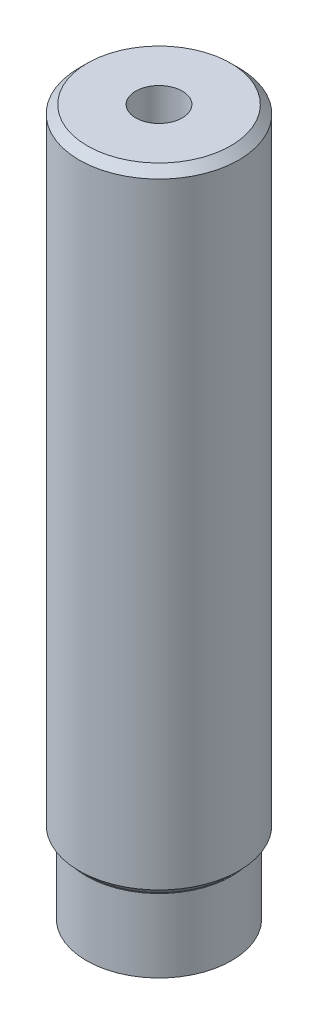
ISO-10303-21;
HEADER;
FILE_DESCRIPTION(('STEP AP214'),'2;1');
FILE_NAME('part.step','',(''),(''),'','','');
FILE_SCHEMA(('AUTOMOTIVE_DESIGN { 1 0 10303 214 1 1 1 1 }'));
ENDSEC;
DATA;
#1=APPLICATION_CONTEXT('core data for automotive mechanical design processes');
#2=APPLICATION_PROTOCOL_DEFINITION('international standard','automotive_design',2000,#1);
#3=PRODUCT_CONTEXT('',#1,'mechanical');
#4=PRODUCT('Part','Part','',(#3));
#5=PRODUCT_RELATED_PRODUCT_CATEGORY('part','',(#4));
#6=PRODUCT_DEFINITION_FORMATION('','',#4);
#7=PRODUCT_DEFINITION_CONTEXT('part definition',#1,'design');
#8=PRODUCT_DEFINITION('design','',#6,#7);
#9=PRODUCT_DEFINITION_SHAPE('','',#8);
#10=(LENGTH_UNIT() NAMED_UNIT(*) SI_UNIT(.MILLI.,.METRE.));
#11=(NAMED_UNIT(*) PLANE_ANGLE_UNIT() SI_UNIT($,.RADIAN.));
#12=(NAMED_UNIT(*) SI_UNIT($,.STERADIAN.) SOLID_ANGLE_UNIT());
#13=UNCERTAINTY_MEASURE_WITH_UNIT(LENGTH_MEASURE(1.E-05),#10,'distance_accuracy_value','');
#14=(GEOMETRIC_REPRESENTATION_CONTEXT(3) GLOBAL_UNCERTAINTY_ASSIGNED_CONTEXT((#13)) GLOBAL_UNIT_ASSIGNED_CONTEXT((#10,
#11,#12)) REPRESENTATION_CONTEXT('',''));
#15=CARTESIAN_POINT('',(0.,0.,0.));
#16=DIRECTION('',(0.,0.,1.));
#17=DIRECTION('',(1.,0.,0.));
#18=AXIS2_PLACEMENT_3D('',#15,#16,#17);
#19=CARTESIAN_POINT('',(5.4585,-5.5,0.));
#20=DIRECTION('',(0.,-1.,0.));
#21=DIRECTION('',(0.,0.,-1.));
#22=AXIS2_PLACEMENT_3D('',#19,#20,#21);
#23=PLANE('',#22);
#24=CARTESIAN_POINT('',(0.,-5.5,0.));
#25=DIRECTION('',(0.,1.,0.));
#26=DIRECTION('',(0.,0.,1.));
#27=AXIS2_PLACEMENT_3D('',#24,#25,#26);
#28=CIRCLE('',#27,5.4585);
#29=CARTESIAN_POINT('',(0.,-5.5,5.4585));
#30=VERTEX_POINT('',#29);
#31=EDGE_CURVE('E10',#30,#30,#28,.T.);
#32=ORIENTED_EDGE('',*,*,#31,.F.);
#33=EDGE_LOOP('',(#32));
#34=FACE_BOUND('',#33,.T.);
#35=CARTESIAN_POINT('',(0.,-5.5,0.));
#36=DIRECTION('',(0.,1.,0.));
#37=DIRECTION('',(0.,0.,1.));
#38=AXIS2_PLACEMENT_3D('',#35,#36,#37);
#39=CIRCLE('',#38,1.);
#40=CARTESIAN_POINT('',(0.,-5.5,1.));
#41=VERTEX_POINT('',#40);
#42=EDGE_CURVE('E89',#41,#41,#39,.T.);
#43=ORIENTED_EDGE('',*,*,#42,.T.);
#44=EDGE_LOOP('',(#43));
#45=FACE_BOUND('',#44,.T.);
#46=ADVANCED_FACE('F15',(#34,#45),#23,.T.);
#47=CARTESIAN_POINT('',(0.,-4.5,0.));
#48=DIRECTION('',(0.,1.,0.));
#49=DIRECTION('',(0.,0.,1.));
#50=AXIS2_PLACEMENT_3D('',#47,#48,#49);
#51=CYLINDRICAL_SURFACE('',#50,5.4585);
#52=CARTESIAN_POINT('',(0.,0.,0.));
#53=DIRECTION('',(0.,1.,0.));
#54=DIRECTION('',(0.,0.,1.));
#55=AXIS2_PLACEMENT_3D('',#52,#53,#54);
#56=CIRCLE('',#55,5.4585);
#57=CARTESIAN_POINT('',(0.,0.,5.4585));
#58=VERTEX_POINT('',#57);
#59=EDGE_CURVE('E26',#58,#58,#56,.T.);
#60=ORIENTED_EDGE('',*,*,#59,.F.);
#61=EDGE_LOOP('',(#60));
#62=FACE_BOUND('',#61,.T.);
#63=ORIENTED_EDGE('',*,*,#31,.T.);
#64=EDGE_LOOP('',(#63));
#65=FACE_BOUND('',#64,.T.);
#66=ADVANCED_FACE('F136',(#62,#65),#51,.T.);
#67=CARTESIAN_POINT('',(0.,0.,0.));
#68=DIRECTION('',(0.,1.,0.));
#69=DIRECTION('',(1.,0.,0.));
#70=AXIS2_PLACEMENT_3D('',#67,#68,#69);
#71=PLANE('',#70);
#72=ORIENTED_EDGE('',*,*,#59,.T.);
#73=EDGE_LOOP('',(#72));
#74=FACE_BOUND('',#73,.T.);
#75=CARTESIAN_POINT('',(0.,0.,0.));
#76=DIRECTION('',(0.,-1.,0.));
#77=DIRECTION('',(0.,0.,1.));
#78=AXIS2_PLACEMENT_3D('',#75,#76,#77);
#79=CIRCLE('',#78,5.3865);
#80=CARTESIAN_POINT('',(0.,0.,5.3865));
#81=VERTEX_POINT('',#80);
#82=EDGE_CURVE('E84',#81,#81,#79,.T.);
#83=ORIENTED_EDGE('',*,*,#82,.T.);
#84=EDGE_LOOP('',(#83));
#85=FACE_BOUND('',#84,.T.);
#86=ADVANCED_FACE('F101',(#74,#85),#71,.T.);
#87=CARTESIAN_POINT('',(0.,-5.5,0.));
#88=DIRECTION('',(0.,-1.,0.));
#89=DIRECTION('',(0.,0.,-1.));
#90=AXIS2_PLACEMENT_3D('',#87,#88,#89);
#91=CONICAL_SURFACE('',#90,1.,0.7853981625);
#92=ORIENTED_EDGE('',*,*,#42,.F.);
#93=EDGE_LOOP('',(#92));
#94=FACE_BOUND('',#93,.T.);
#95=CARTESIAN_POINT('',(0.,-4.5,0.));
#96=VERTEX_POINT('',#95);
#97=VERTEX_LOOP('',#96);
#98=FACE_BOUND('',#97,.T.);
#99=ADVANCED_FACE('F97',(#94,#98),#91,.F.);
#100=CARTESIAN_POINT('',(0.,0.,0.));
#101=DIRECTION('',(0.,1.,0.));
#102=DIRECTION('',(1.,0.,0.));
#103=AXIS2_PLACEMENT_3D('',#100,#101,#102);
#104=PLANE('',#103);
#105=CARTESIAN_POINT('',(0.,0.,0.));
#106=DIRECTION('',(0.,1.,0.));
#107=DIRECTION('',(0.,0.,1.));
#108=AXIS2_PLACEMENT_3D('',#105,#106,#107);
#109=CIRCLE('',#108,1.75);
#110=CARTESIAN_POINT('',(0.,0.,1.75));
#111=VERTEX_POINT('',#110);
#112=EDGE_CURVE('E73',#111,#111,#109,.T.);
#113=ORIENTED_EDGE('',*,*,#112,.T.);
#114=EDGE_LOOP('',(#113));
#115=FACE_BOUND('',#114,.T.);
#116=ADVANCED_FACE('F100',(#115),#104,.T.);
#117=CARTESIAN_POINT('',(0.,0.,0.));
#118=DIRECTION('',(0.,1.,0.));
#119=DIRECTION('',(0.,0.,1.));
#120=AXIS2_PLACEMENT_3D('',#117,#118,#119);
#121=CYLINDRICAL_SURFACE('',#120,1.75);
#122=CARTESIAN_POINT('',(0.,47.5,0.));
#123=DIRECTION('',(0.,1.,0.));
#124=DIRECTION('',(0.,0.,1.));
#125=AXIS2_PLACEMENT_3D('',#122,#123,#124);
#126=CIRCLE('',#125,1.75);
#127=CARTESIAN_POINT('',(0.,47.5,1.75));
#128=VERTEX_POINT('',#127);
#129=EDGE_CURVE('E69',#128,#128,#126,.T.);
#130=ORIENTED_EDGE('',*,*,#129,.T.);
#131=EDGE_LOOP('',(#130));
#132=FACE_BOUND('',#131,.T.);
#133=ORIENTED_EDGE('',*,*,#112,.F.);
#134=EDGE_LOOP('',(#133));
#135=FACE_BOUND('',#134,.T.);
#136=ADVANCED_FACE('F166',(#132,#135),#121,.F.);
#137=CARTESIAN_POINT('',(0.,0.,0.));
#138=DIRECTION('',(0.,1.,0.));
#139=DIRECTION('',(0.,0.,1.));
#140=AXIS2_PLACEMENT_3D('',#137,#138,#139);
#141=CYLINDRICAL_SURFACE('',#140,6.);
#142=CARTESIAN_POINT('',(0.,46.8865,0.));
#143=DIRECTION('',(0.,1.,0.));
#144=DIRECTION('',(0.,0.,1.));
#145=AXIS2_PLACEMENT_3D('',#142,#143,#144);
#146=CIRCLE('',#145,6.);
#147=CARTESIAN_POINT('',(0.,46.8865,6.));
#148=VERTEX_POINT('',#147);
#149=EDGE_CURVE('E60',#148,#148,#146,.T.);
#150=ORIENTED_EDGE('',*,*,#149,.F.);
#151=EDGE_LOOP('',(#150));
#152=FACE_BOUND('',#151,.T.);
#153=CARTESIAN_POINT('',(0.,0.6135,0.));
#154=DIRECTION('',(0.,1.,0.));
#155=DIRECTION('',(0.,0.,1.));
#156=AXIS2_PLACEMENT_3D('',#153,#154,#155);
#157=CIRCLE('',#156,6.);
#158=CARTESIAN_POINT('',(0.,0.6135,6.));
#159=VERTEX_POINT('',#158);
#160=EDGE_CURVE('E76',#159,#159,#157,.T.);
#161=ORIENTED_EDGE('',*,*,#160,.T.);
#162=EDGE_LOOP('',(#161));
#163=FACE_BOUND('',#162,.T.);
#164=ADVANCED_FACE('F118',(#152,#163),#141,.T.);
#165=CARTESIAN_POINT('',(0.,47.5,0.));
#166=DIRECTION('',(0.,-1.,0.));
#167=DIRECTION('',(0.,0.,-1.));
#168=AXIS2_PLACEMENT_3D('',#165,#166,#167);
#169=CONICAL_SURFACE('',#168,5.3865,0.785398162499998);
#170=CARTESIAN_POINT('',(0.,47.5,0.));
#171=DIRECTION('',(0.,1.,0.));
#172=DIRECTION('',(0.,0.,1.));
#173=AXIS2_PLACEMENT_3D('',#170,#171,#172);
#174=CIRCLE('',#173,5.3865);
#175=CARTESIAN_POINT('',(0.,47.5,5.3865));
#176=VERTEX_POINT('',#175);
#177=EDGE_CURVE('E19',#176,#176,#174,.T.);
#178=ORIENTED_EDGE('',*,*,#177,.F.);
#179=EDGE_LOOP('',(#178));
#180=FACE_BOUND('',#179,.T.);
#181=ORIENTED_EDGE('',*,*,#149,.T.);
#182=EDGE_LOOP('',(#181));
#183=FACE_BOUND('',#182,.T.);
#184=ADVANCED_FACE('F133',(#180,#183),#169,.T.);
#185=CARTESIAN_POINT('',(0.,47.5,0.));
#186=DIRECTION('',(0.,1.,0.));
#187=DIRECTION('',(1.,0.,0.));
#188=AXIS2_PLACEMENT_3D('',#185,#186,#187);
#189=PLANE('',#188);
#190=ORIENTED_EDGE('',*,*,#177,.T.);
#191=EDGE_LOOP('',(#190));
#192=FACE_BOUND('',#191,.T.);
#193=ORIENTED_EDGE('',*,*,#129,.F.);
#194=EDGE_LOOP('',(#193));
#195=FACE_BOUND('',#194,.T.);
#196=ADVANCED_FACE('F17',(#192,#195),#189,.T.);
#197=CARTESIAN_POINT('',(0.,0.6135,0.));
#198=DIRECTION('',(0.,1.,0.));
#199=DIRECTION('',(0.,0.,1.));
#200=AXIS2_PLACEMENT_3D('',#197,#198,#199);
#201=CONICAL_SURFACE('',#200,6.,0.7853981625);
#202=ORIENTED_EDGE('',*,*,#160,.F.);
#203=EDGE_LOOP('',(#202));
#204=FACE_BOUND('',#203,.T.);
#205=ORIENTED_EDGE('',*,*,#82,.F.);
#206=EDGE_LOOP('',(#205));
#207=FACE_BOUND('',#206,.T.);
#208=ADVANCED_FACE('F120',(#204,#207),#201,.T.);
#209=CLOSED_SHELL('',(#46,#66,#86,#99,#116,#136,#164,#184,#196,#208));
#210=MANIFOLD_SOLID_BREP('B1',#209);
#211=ADVANCED_BREP_SHAPE_REPRESENTATION('',(#18,#210),#14);
#212=SHAPE_DEFINITION_REPRESENTATION(#9,#211);
ENDSEC;
END-ISO-10303-21;
